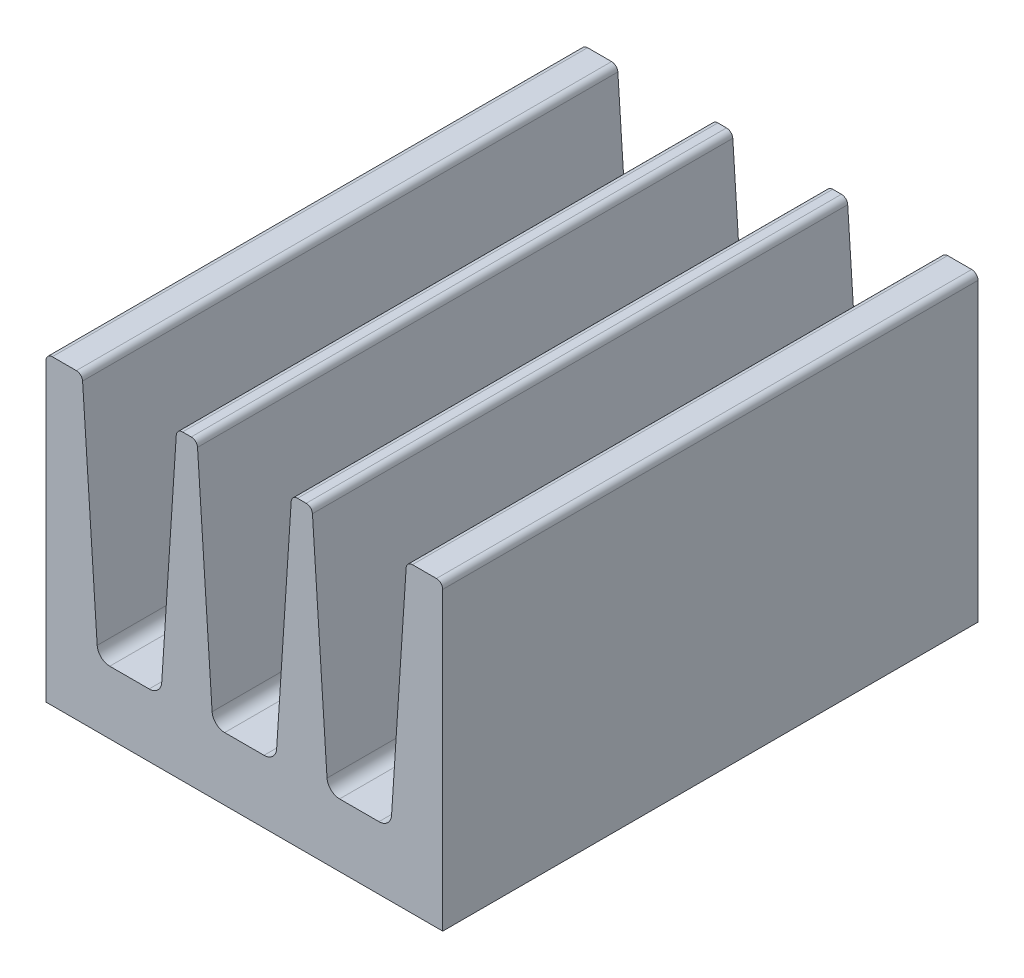
ISO-10303-21;
HEADER;
FILE_DESCRIPTION(('STEP AP214'),'2;1');
FILE_NAME('part.step','',(''),(''),'','','');
FILE_SCHEMA(('AUTOMOTIVE_DESIGN { 1 0 10303 214 1 1 1 1 }'));
ENDSEC;
DATA;
#1=APPLICATION_CONTEXT('core data for automotive mechanical design processes');
#2=APPLICATION_PROTOCOL_DEFINITION('international standard','automotive_design',2000,#1);
#3=PRODUCT_CONTEXT('',#1,'mechanical');
#4=PRODUCT('Part','Part','',(#3));
#5=PRODUCT_RELATED_PRODUCT_CATEGORY('part','',(#4));
#6=PRODUCT_DEFINITION_FORMATION('','',#4);
#7=PRODUCT_DEFINITION_CONTEXT('part definition',#1,'design');
#8=PRODUCT_DEFINITION('design','',#6,#7);
#9=PRODUCT_DEFINITION_SHAPE('','',#8);
#10=(LENGTH_UNIT() NAMED_UNIT(*) SI_UNIT(.MILLI.,.METRE.));
#11=(NAMED_UNIT(*) PLANE_ANGLE_UNIT() SI_UNIT($,.RADIAN.));
#12=(NAMED_UNIT(*) SI_UNIT($,.STERADIAN.) SOLID_ANGLE_UNIT());
#13=UNCERTAINTY_MEASURE_WITH_UNIT(LENGTH_MEASURE(1.E-05),#10,'distance_accuracy_value','');
#14=(GEOMETRIC_REPRESENTATION_CONTEXT(3) GLOBAL_UNCERTAINTY_ASSIGNED_CONTEXT((#13)) GLOBAL_UNIT_ASSIGNED_CONTEXT((#10,
#11,#12)) REPRESENTATION_CONTEXT('',''));
#15=CARTESIAN_POINT('',(0.,0.,0.));
#16=DIRECTION('',(0.,0.,1.));
#17=DIRECTION('',(1.,0.,0.));
#18=AXIS2_PLACEMENT_3D('',#15,#16,#17);
#19=CARTESIAN_POINT('',(0.,4.8,0.));
#20=DIRECTION('',(0.,-1.,0.));
#21=DIRECTION('',(0.,0.,-1.));
#22=AXIS2_PLACEMENT_3D('',#19,#20,#21);
#23=PLANE('',#22);
#24=DIRECTION('',(-1.,0.,0.));
#25=VECTOR('',#24,1.);
#26=CARTESIAN_POINT('',(0.,4.8,-8.5));
#27=LINE('',#26,#25);
#28=CARTESIAN_POINT('',(4.131362768293,4.8,-8.5));
#29=VERTEX_POINT('',#28);
#30=CARTESIAN_POINT('',(3.993637231707,4.8,-8.5));
#31=VERTEX_POINT('',#30);
#32=EDGE_CURVE('E265',#29,#31,#27,.T.);
#33=ORIENTED_EDGE('',*,*,#32,.T.);
#34=DIRECTION('',(0.,0.,-1.));
#35=VECTOR('',#34,1.);
#36=CARTESIAN_POINT('',(3.993637231707,4.8,0.));
#37=LINE('',#36,#35);
#38=CARTESIAN_POINT('',(3.993637231707,4.8,0.));
#39=VERTEX_POINT('',#38);
#40=EDGE_CURVE('E417',#31,#39,#37,.F.);
#41=ORIENTED_EDGE('',*,*,#40,.T.);
#42=DIRECTION('',(1.,0.,0.));
#43=VECTOR('',#42,1.);
#44=CARTESIAN_POINT('',(0.,4.8,0.));
#45=LINE('',#44,#43);
#46=CARTESIAN_POINT('',(4.131362768293,4.8,0.));
#47=VERTEX_POINT('',#46);
#48=EDGE_CURVE('E449',#39,#47,#45,.T.);
#49=ORIENTED_EDGE('',*,*,#48,.T.);
#50=DIRECTION('',(0.,0.,1.));
#51=VECTOR('',#50,1.);
#52=CARTESIAN_POINT('',(4.131362768293,4.8,-8.5));
#53=LINE('',#52,#51);
#54=EDGE_CURVE('E414',#47,#29,#53,.F.);
#55=ORIENTED_EDGE('',*,*,#54,.T.);
#56=EDGE_LOOP('',(#33,#41,#49,#55));
#57=FACE_BOUND('',#56,.T.);
#58=ADVANCED_FACE('F37',(#57),#23,.F.);
#59=CARTESIAN_POINT('',(2.306362768293,4.8,-8.5));
#60=VERTEX_POINT('',#59);
#61=CARTESIAN_POINT('',(2.168637231707,4.8,-8.5));
#62=VERTEX_POINT('',#61);
#63=EDGE_CURVE('E458',#60,#62,#27,.T.);
#64=ORIENTED_EDGE('',*,*,#63,.T.);
#65=DIRECTION('',(0.,0.,-1.));
#66=VECTOR('',#65,1.);
#67=CARTESIAN_POINT('',(2.168637231707,4.8,0.));
#68=LINE('',#67,#66);
#69=CARTESIAN_POINT('',(2.168637231707,4.8,0.));
#70=VERTEX_POINT('',#69);
#71=EDGE_CURVE('E407',#62,#70,#68,.F.);
#72=ORIENTED_EDGE('',*,*,#71,.T.);
#73=CARTESIAN_POINT('',(2.306362768293,4.8,0.));
#74=VERTEX_POINT('',#73);
#75=EDGE_CURVE('E452',#70,#74,#45,.T.);
#76=ORIENTED_EDGE('',*,*,#75,.T.);
#77=DIRECTION('',(0.,0.,1.));
#78=VECTOR('',#77,1.);
#79=CARTESIAN_POINT('',(2.306362768293,4.8,-8.5));
#80=LINE('',#79,#78);
#81=EDGE_CURVE('E404',#74,#60,#80,.F.);
#82=ORIENTED_EDGE('',*,*,#81,.T.);
#83=EDGE_LOOP('',(#64,#72,#76,#82));
#84=FACE_BOUND('',#83,.T.);
#85=ADVANCED_FACE('F464',(#84),#23,.F.);
#86=CARTESIAN_POINT('',(0.481362768293002,4.8,-8.5));
#87=VERTEX_POINT('',#86);
#88=CARTESIAN_POINT('',(0.1,4.8,-8.5));
#89=VERTEX_POINT('',#88);
#90=EDGE_CURVE('E454',#87,#89,#27,.T.);
#91=ORIENTED_EDGE('',*,*,#90,.T.);
#92=DIRECTION('',(0.,0.,1.));
#93=VECTOR('',#92,1.);
#94=CARTESIAN_POINT('',(0.1,4.8,0.));
#95=LINE('',#94,#93);
#96=CARTESIAN_POINT('',(0.1,4.8,0.));
#97=VERTEX_POINT('',#96);
#98=EDGE_CURVE('E368',#89,#97,#95,.T.);
#99=ORIENTED_EDGE('',*,*,#98,.T.);
#100=CARTESIAN_POINT('',(0.481362768293003,4.8,0.));
#101=VERTEX_POINT('',#100);
#102=EDGE_CURVE('E450',#97,#101,#45,.T.);
#103=ORIENTED_EDGE('',*,*,#102,.T.);
#104=DIRECTION('',(0.,0.,1.));
#105=VECTOR('',#104,1.);
#106=CARTESIAN_POINT('',(0.481362768293002,4.8,-8.5));
#107=LINE('',#106,#105);
#108=EDGE_CURVE('E365',#101,#87,#107,.F.);
#109=ORIENTED_EDGE('',*,*,#108,.T.);
#110=EDGE_LOOP('',(#91,#99,#103,#109));
#111=FACE_BOUND('',#110,.T.);
#112=ADVANCED_FACE('F526',(#111),#23,.F.);
#113=CARTESIAN_POINT('',(0.,4.8,0.));
#114=DIRECTION('',(1.,0.,0.));
#115=DIRECTION('',(0.,0.,-1.));
#116=AXIS2_PLACEMENT_3D('',#113,#114,#115);
#117=PLANE('',#116);
#118=DIRECTION('',(0.,-1.,0.));
#119=VECTOR('',#118,1.);
#120=CARTESIAN_POINT('',(0.,4.8,0.));
#121=LINE('',#120,#119);
#122=CARTESIAN_POINT('',(0.,4.7,0.));
#123=VERTEX_POINT('',#122);
#124=CARTESIAN_POINT('',(0.,0.,0.));
#125=VERTEX_POINT('',#124);
#126=EDGE_CURVE('E233',#123,#125,#121,.T.);
#127=ORIENTED_EDGE('',*,*,#126,.F.);
#128=DIRECTION('',(0.,0.,1.));
#129=VECTOR('',#128,1.);
#130=CARTESIAN_POINT('',(0.,4.7,0.));
#131=LINE('',#130,#129);
#132=CARTESIAN_POINT('',(0.,4.7,-8.5));
#133=VERTEX_POINT('',#132);
#134=EDGE_CURVE('E386',#123,#133,#131,.F.);
#135=ORIENTED_EDGE('',*,*,#134,.T.);
#136=DIRECTION('',(0.,-1.,0.));
#137=VECTOR('',#136,1.);
#138=CARTESIAN_POINT('',(0.,4.8,-8.5));
#139=LINE('',#138,#137);
#140=CARTESIAN_POINT('',(0.,0.,-8.5));
#141=VERTEX_POINT('',#140);
#142=EDGE_CURVE('E257',#133,#141,#139,.T.);
#143=ORIENTED_EDGE('',*,*,#142,.T.);
#144=DIRECTION('',(0.,0.,1.));
#145=VECTOR('',#144,1.);
#146=CARTESIAN_POINT('',(0.,0.,0.));
#147=LINE('',#146,#145);
#148=EDGE_CURVE('E251',#141,#125,#147,.T.);
#149=ORIENTED_EDGE('',*,*,#148,.T.);
#150=EDGE_LOOP('',(#127,#135,#143,#149));
#151=FACE_BOUND('',#150,.T.);
#152=ADVANCED_FACE('F255',(#151),#117,.F.);
#153=CARTESIAN_POINT('',(0.,4.8,0.));
#154=DIRECTION('',(0.,0.,-1.));
#155=DIRECTION('',(-1.,0.,0.));
#156=AXIS2_PLACEMENT_3D('',#153,#154,#155);
#157=PLANE('',#156);
#158=ORIENTED_EDGE('',*,*,#102,.F.);
#159=CARTESIAN_POINT('',(0.1,4.7,0.));
#160=DIRECTION('',(0.,0.,-1.));
#161=DIRECTION('',(-1.,0.,0.));
#162=AXIS2_PLACEMENT_3D('',#159,#160,#161);
#163=CIRCLE('',#162,0.1);
#164=EDGE_CURVE('E240',#97,#123,#163,.F.);
#165=ORIENTED_EDGE('',*,*,#164,.T.);
#166=ORIENTED_EDGE('',*,*,#126,.T.);
#167=DIRECTION('',(1.,0.,0.));
#168=VECTOR('',#167,1.);
#169=CARTESIAN_POINT('',(0.,0.,0.));
#170=LINE('',#169,#168);
#171=CARTESIAN_POINT('',(6.3,0.,0.));
#172=VERTEX_POINT('',#171);
#173=EDGE_CURVE('E238',#125,#172,#170,.T.);
#174=ORIENTED_EDGE('',*,*,#173,.T.);
#175=DIRECTION('',(0.,-1.,0.));
#176=VECTOR('',#175,1.);
#177=CARTESIAN_POINT('',(6.3,4.8,0.));
#178=LINE('',#177,#176);
#179=CARTESIAN_POINT('',(6.3,4.7,0.));
#180=VERTEX_POINT('',#179);
#181=EDGE_CURVE('E245',#180,#172,#178,.T.);
#182=ORIENTED_EDGE('',*,*,#181,.F.);
#183=CARTESIAN_POINT('',(6.2,4.7,0.));
#184=DIRECTION('',(0.,0.,-1.));
#185=DIRECTION('',(-1.,0.,0.));
#186=AXIS2_PLACEMENT_3D('',#183,#184,#185);
#187=CIRCLE('',#186,0.1);
#188=CARTESIAN_POINT('',(6.2,4.8,0.));
#189=VERTEX_POINT('',#188);
#190=EDGE_CURVE('E371',#180,#189,#187,.F.);
#191=ORIENTED_EDGE('',*,*,#190,.T.);
#192=CARTESIAN_POINT('',(5.818637231707,4.8,0.));
#193=VERTEX_POINT('',#192);
#194=EDGE_CURVE('E271',#193,#189,#45,.T.);
#195=ORIENTED_EDGE('',*,*,#194,.F.);
#196=CARTESIAN_POINT('',(5.818637231707,4.7,0.));
#197=DIRECTION('',(0.,0.,-1.));
#198=DIRECTION('',(-1.,0.,0.));
#199=AXIS2_PLACEMENT_3D('',#196,#197,#198);
#200=CIRCLE('',#199,0.1);
#201=CARTESIAN_POINT('',(5.71885294445659,4.70656475574016,0.));
#202=VERTEX_POINT('',#201);
#203=EDGE_CURVE('E373',#193,#202,#200,.F.);
#204=ORIENTED_EDGE('',*,*,#203,.T.);
#205=DIRECTION('',(0.0656475574015812,0.997842872504086,0.));
#206=VECTOR('',#205,1.);
#207=CARTESIAN_POINT('',(5.475,0.999999999999813,0.));
#208=LINE('',#207,#206);
#209=CARTESIAN_POINT('',(5.48729411108683,1.18687048851968,0.));
#210=VERTEX_POINT('',#209);
#211=EDGE_CURVE('E303',#202,#210,#208,.F.);
#212=ORIENTED_EDGE('',*,*,#211,.T.);
#213=CARTESIAN_POINT('',(5.28772553658602,1.2,0.));
#214=DIRECTION('',(0.,0.,-1.));
#215=DIRECTION('',(-1.,0.,0.));
#216=AXIS2_PLACEMENT_3D('',#213,#214,#215);
#217=CIRCLE('',#216,0.2);
#218=CARTESIAN_POINT('',(5.28772553658602,1.,0.));
#219=VERTEX_POINT('',#218);
#220=EDGE_CURVE('E359',#210,#219,#217,.T.);
#221=ORIENTED_EDGE('',*,*,#220,.T.);
#222=DIRECTION('',(1.,0.,0.));
#223=VECTOR('',#222,1.);
#224=CARTESIAN_POINT('',(4.475,1.,0.));
#225=LINE('',#224,#223);
#226=CARTESIAN_POINT('',(4.66227446341399,1.,0.));
#227=VERTEX_POINT('',#226);
#228=EDGE_CURVE('E497',#227,#219,#225,.T.);
#229=ORIENTED_EDGE('',*,*,#228,.F.);
#230=CARTESIAN_POINT('',(4.66227446341399,1.2,0.));
#231=DIRECTION('',(0.,0.,-1.));
#232=DIRECTION('',(-1.,0.,0.));
#233=AXIS2_PLACEMENT_3D('',#230,#231,#232);
#234=CIRCLE('',#233,0.2);
#235=CARTESIAN_POINT('',(4.46270588891317,1.18687048851968,0.));
#236=VERTEX_POINT('',#235);
#237=EDGE_CURVE('E361',#227,#236,#234,.T.);
#238=ORIENTED_EDGE('',*,*,#237,.T.);
#239=DIRECTION('',(0.0656475574015812,-0.997842872504086,0.));
#240=VECTOR('',#239,1.);
#241=CARTESIAN_POINT('',(4.475,0.999999999999813,0.));
#242=LINE('',#241,#240);
#243=CARTESIAN_POINT('',(4.23114705554341,4.70656475574016,0.));
#244=VERTEX_POINT('',#243);
#245=EDGE_CURVE('E300',#236,#244,#242,.F.);
#246=ORIENTED_EDGE('',*,*,#245,.T.);
#247=CARTESIAN_POINT('',(4.131362768293,4.7,0.));
#248=DIRECTION('',(0.,0.,-1.));
#249=DIRECTION('',(-1.,0.,0.));
#250=AXIS2_PLACEMENT_3D('',#247,#248,#249);
#251=CIRCLE('',#250,0.1);
#252=EDGE_CURVE('E375',#244,#47,#251,.F.);
#253=ORIENTED_EDGE('',*,*,#252,.T.);
#254=ORIENTED_EDGE('',*,*,#48,.F.);
#255=CARTESIAN_POINT('',(3.993637231707,4.7,0.));
#256=DIRECTION('',(0.,0.,-1.));
#257=DIRECTION('',(-1.,0.,0.));
#258=AXIS2_PLACEMENT_3D('',#255,#256,#257);
#259=CIRCLE('',#258,0.1);
#260=CARTESIAN_POINT('',(3.89385294445659,4.70656475574016,0.));
#261=VERTEX_POINT('',#260);
#262=EDGE_CURVE('E377',#39,#261,#259,.F.);
#263=ORIENTED_EDGE('',*,*,#262,.T.);
#264=DIRECTION('',(0.0656475574015811,0.997842872504086,0.));
#265=VECTOR('',#264,1.);
#266=CARTESIAN_POINT('',(3.65,0.999999999999799,0.));
#267=LINE('',#266,#265);
#268=CARTESIAN_POINT('',(3.66229411108684,1.18687048851968,0.));
#269=VERTEX_POINT('',#268);
#270=EDGE_CURVE('E298',#261,#269,#267,.F.);
#271=ORIENTED_EDGE('',*,*,#270,.T.);
#272=CARTESIAN_POINT('',(3.46272553658602,1.2,0.));
#273=DIRECTION('',(0.,0.,-1.));
#274=DIRECTION('',(-1.,0.,0.));
#275=AXIS2_PLACEMENT_3D('',#272,#273,#274);
#276=CIRCLE('',#275,0.2);
#277=CARTESIAN_POINT('',(3.46272553658602,1.,0.));
#278=VERTEX_POINT('',#277);
#279=EDGE_CURVE('E355',#269,#278,#276,.T.);
#280=ORIENTED_EDGE('',*,*,#279,.T.);
#281=DIRECTION('',(1.,0.,0.));
#282=VECTOR('',#281,1.);
#283=CARTESIAN_POINT('',(2.65,1.,0.));
#284=LINE('',#283,#282);
#285=CARTESIAN_POINT('',(2.83727446341398,1.,0.));
#286=VERTEX_POINT('',#285);
#287=EDGE_CURVE('E488',#286,#278,#284,.T.);
#288=ORIENTED_EDGE('',*,*,#287,.F.);
#289=CARTESIAN_POINT('',(2.83727446341398,1.2,0.));
#290=DIRECTION('',(0.,0.,-1.));
#291=DIRECTION('',(-1.,0.,0.));
#292=AXIS2_PLACEMENT_3D('',#289,#290,#291);
#293=CIRCLE('',#292,0.2);
#294=CARTESIAN_POINT('',(2.63770588891317,1.18687048851968,0.));
#295=VERTEX_POINT('',#294);
#296=EDGE_CURVE('E349',#286,#295,#293,.T.);
#297=ORIENTED_EDGE('',*,*,#296,.T.);
#298=DIRECTION('',(0.0656475574015811,-0.997842872504086,0.));
#299=VECTOR('',#298,1.);
#300=CARTESIAN_POINT('',(2.65,0.999999999999799,0.));
#301=LINE('',#300,#299);
#302=CARTESIAN_POINT('',(2.40614705554341,4.70656475574016,0.));
#303=VERTEX_POINT('',#302);
#304=EDGE_CURVE('E295',#295,#303,#301,.F.);
#305=ORIENTED_EDGE('',*,*,#304,.T.);
#306=CARTESIAN_POINT('',(2.306362768293,4.7,0.));
#307=DIRECTION('',(0.,0.,-1.));
#308=DIRECTION('',(-1.,0.,0.));
#309=AXIS2_PLACEMENT_3D('',#306,#307,#308);
#310=CIRCLE('',#309,0.1);
#311=EDGE_CURVE('E379',#303,#74,#310,.F.);
#312=ORIENTED_EDGE('',*,*,#311,.T.);
#313=ORIENTED_EDGE('',*,*,#75,.F.);
#314=CARTESIAN_POINT('',(2.168637231707,4.7,0.));
#315=DIRECTION('',(0.,0.,-1.));
#316=DIRECTION('',(-1.,0.,0.));
#317=AXIS2_PLACEMENT_3D('',#314,#315,#316);
#318=CIRCLE('',#317,0.1);
#319=CARTESIAN_POINT('',(2.06885294445659,4.70656475574016,0.));
#320=VERTEX_POINT('',#319);
#321=EDGE_CURVE('E381',#70,#320,#318,.F.);
#322=ORIENTED_EDGE('',*,*,#321,.T.);
#323=DIRECTION('',(0.0656475574015811,0.997842872504086,0.));
#324=VECTOR('',#323,1.);
#325=CARTESIAN_POINT('',(1.825,0.999999999999802,0.));
#326=LINE('',#325,#324);
#327=CARTESIAN_POINT('',(1.83729411108684,1.18687048851968,0.));
#328=VERTEX_POINT('',#327);
#329=EDGE_CURVE('E293',#320,#328,#326,.F.);
#330=ORIENTED_EDGE('',*,*,#329,.T.);
#331=CARTESIAN_POINT('',(1.63772553658602,1.2,0.));
#332=DIRECTION('',(0.,0.,-1.));
#333=DIRECTION('',(-1.,0.,0.));
#334=AXIS2_PLACEMENT_3D('',#331,#332,#333);
#335=CIRCLE('',#334,0.2);
#336=CARTESIAN_POINT('',(1.63772553658602,1.,0.));
#337=VERTEX_POINT('',#336);
#338=EDGE_CURVE('E347',#328,#337,#335,.T.);
#339=ORIENTED_EDGE('',*,*,#338,.T.);
#340=DIRECTION('',(1.,0.,0.));
#341=VECTOR('',#340,1.);
#342=CARTESIAN_POINT('',(0.825000000000001,1.,0.));
#343=LINE('',#342,#341);
#344=CARTESIAN_POINT('',(1.01227446341398,1.,0.));
#345=VERTEX_POINT('',#344);
#346=EDGE_CURVE('E262',#345,#337,#343,.T.);
#347=ORIENTED_EDGE('',*,*,#346,.F.);
#348=CARTESIAN_POINT('',(1.01227446341398,1.2,0.));
#349=DIRECTION('',(0.,0.,-1.));
#350=DIRECTION('',(-1.,0.,0.));
#351=AXIS2_PLACEMENT_3D('',#348,#349,#350);
#352=CIRCLE('',#351,0.2);
#353=CARTESIAN_POINT('',(0.812705888913167,1.18687048851968,0.));
#354=VERTEX_POINT('',#353);
#355=EDGE_CURVE('E341',#345,#354,#352,.T.);
#356=ORIENTED_EDGE('',*,*,#355,.T.);
#357=DIRECTION('',(0.0656475574015811,-0.997842872504086,0.));
#358=VECTOR('',#357,1.);
#359=CARTESIAN_POINT('',(0.825000000000001,0.999999999999802,0.));
#360=LINE('',#359,#358);
#361=CARTESIAN_POINT('',(0.581147055543412,4.70656475574016,0.));
#362=VERTEX_POINT('',#361);
#363=EDGE_CURVE('E290',#354,#362,#360,.F.);
#364=ORIENTED_EDGE('',*,*,#363,.T.);
#365=CARTESIAN_POINT('',(0.481362768293003,4.7,0.));
#366=DIRECTION('',(0.,0.,-1.));
#367=DIRECTION('',(-1.,0.,0.));
#368=AXIS2_PLACEMENT_3D('',#365,#366,#367);
#369=CIRCLE('',#368,0.1);
#370=EDGE_CURVE('E383',#362,#101,#369,.F.);
#371=ORIENTED_EDGE('',*,*,#370,.T.);
#372=EDGE_LOOP('',(#158,#165,#166,#174,#182,#191,#195,#204,#212,#221,#229,#238,#246,#253,#254,
#263,#271,#280,#288,#297,#305,#312,#313,#322,#330,#339,#347,#356,#364,#371));
#373=FACE_BOUND('',#372,.T.);
#374=ADVANCED_FACE('F236',(#373),#157,.F.);
#375=CARTESIAN_POINT('',(6.3,4.8,0.));
#376=DIRECTION('',(-1.,0.,0.));
#377=DIRECTION('',(0.,0.,1.));
#378=AXIS2_PLACEMENT_3D('',#375,#376,#377);
#379=PLANE('',#378);
#380=DIRECTION('',(0.,-1.,0.));
#381=VECTOR('',#380,1.);
#382=CARTESIAN_POINT('',(6.3,4.8,-8.5));
#383=LINE('',#382,#381);
#384=CARTESIAN_POINT('',(6.3,4.7,-8.5));
#385=VERTEX_POINT('',#384);
#386=CARTESIAN_POINT('',(6.3,0.,-8.5));
#387=VERTEX_POINT('',#386);
#388=EDGE_CURVE('E273',#385,#387,#383,.T.);
#389=ORIENTED_EDGE('',*,*,#388,.F.);
#390=DIRECTION('',(0.,0.,-1.));
#391=VECTOR('',#390,1.);
#392=CARTESIAN_POINT('',(6.3,4.7,0.));
#393=LINE('',#392,#391);
#394=EDGE_CURVE('E11',#385,#180,#393,.F.);
#395=ORIENTED_EDGE('',*,*,#394,.T.);
#396=ORIENTED_EDGE('',*,*,#181,.T.);
#397=DIRECTION('',(0.,0.,-1.));
#398=VECTOR('',#397,1.);
#399=CARTESIAN_POINT('',(6.3,0.,0.));
#400=LINE('',#399,#398);
#401=EDGE_CURVE('E253',#172,#387,#400,.T.);
#402=ORIENTED_EDGE('',*,*,#401,.T.);
#403=EDGE_LOOP('',(#389,#395,#396,#402));
#404=FACE_BOUND('',#403,.T.);
#405=ADVANCED_FACE('F535',(#404),#379,.F.);
#406=CARTESIAN_POINT('',(0.,4.8,-8.5));
#407=DIRECTION('',(0.,0.,1.));
#408=DIRECTION('',(1.,0.,0.));
#409=AXIS2_PLACEMENT_3D('',#406,#407,#408);
#410=PLANE('',#409);
#411=ORIENTED_EDGE('',*,*,#142,.F.);
#412=CARTESIAN_POINT('',(0.1,4.7,-8.5));
#413=DIRECTION('',(0.,0.,1.));
#414=DIRECTION('',(1.,0.,0.));
#415=AXIS2_PLACEMENT_3D('',#412,#413,#414);
#416=CIRCLE('',#415,0.1);
#417=EDGE_CURVE('E400',#133,#89,#416,.F.);
#418=ORIENTED_EDGE('',*,*,#417,.T.);
#419=ORIENTED_EDGE('',*,*,#90,.F.);
#420=CARTESIAN_POINT('',(0.481362768293002,4.7,-8.5));
#421=DIRECTION('',(0.,0.,1.));
#422=DIRECTION('',(1.,0.,0.));
#423=AXIS2_PLACEMENT_3D('',#420,#421,#422);
#424=CIRCLE('',#423,0.1);
#425=CARTESIAN_POINT('',(0.581147055543411,4.70656475574016,-8.5));
#426=VERTEX_POINT('',#425);
#427=EDGE_CURVE('E398',#87,#426,#424,.F.);
#428=ORIENTED_EDGE('',*,*,#427,.T.);
#429=DIRECTION('',(-0.0656475574015811,0.997842872504086,0.));
#430=VECTOR('',#429,1.);
#431=CARTESIAN_POINT('',(0.825,0.999999999999802,-8.5));
#432=LINE('',#431,#430);
#433=CARTESIAN_POINT('',(0.812705888913167,1.18687048851968,-8.5));
#434=VERTEX_POINT('',#433);
#435=EDGE_CURVE('E244',#426,#434,#432,.F.);
#436=ORIENTED_EDGE('',*,*,#435,.T.);
#437=CARTESIAN_POINT('',(1.01227446341398,1.2,-8.5));
#438=DIRECTION('',(0.,0.,1.));
#439=DIRECTION('',(1.,0.,0.));
#440=AXIS2_PLACEMENT_3D('',#437,#438,#439);
#441=CIRCLE('',#440,0.2);
#442=CARTESIAN_POINT('',(1.01227446341398,1.,-8.5));
#443=VERTEX_POINT('',#442);
#444=EDGE_CURVE('E343',#434,#443,#441,.T.);
#445=ORIENTED_EDGE('',*,*,#444,.T.);
#446=DIRECTION('',(-1.,0.,0.));
#447=VECTOR('',#446,1.);
#448=CARTESIAN_POINT('',(0.825,1.,-8.5));
#449=LINE('',#448,#447);
#450=CARTESIAN_POINT('',(1.63772553658602,1.,-8.5));
#451=VERTEX_POINT('',#450);
#452=EDGE_CURVE('E259',#451,#443,#449,.T.);
#453=ORIENTED_EDGE('',*,*,#452,.F.);
#454=CARTESIAN_POINT('',(1.63772553658602,1.2,-8.5));
#455=DIRECTION('',(0.,0.,1.));
#456=DIRECTION('',(1.,0.,0.));
#457=AXIS2_PLACEMENT_3D('',#454,#455,#456);
#458=CIRCLE('',#457,0.2);
#459=CARTESIAN_POINT('',(1.83729411108683,1.18687048851968,-8.5));
#460=VERTEX_POINT('',#459);
#461=EDGE_CURVE('E345',#451,#460,#458,.T.);
#462=ORIENTED_EDGE('',*,*,#461,.T.);
#463=DIRECTION('',(-0.0656475574015811,-0.997842872504086,0.));
#464=VECTOR('',#463,1.);
#465=CARTESIAN_POINT('',(1.825,0.999999999999802,-8.5));
#466=LINE('',#465,#464);
#467=CARTESIAN_POINT('',(2.06885294445659,4.70656475574016,-8.5));
#468=VERTEX_POINT('',#467);
#469=EDGE_CURVE('E278',#460,#468,#466,.F.);
#470=ORIENTED_EDGE('',*,*,#469,.T.);
#471=CARTESIAN_POINT('',(2.168637231707,4.7,-8.5));
#472=DIRECTION('',(0.,0.,1.));
#473=DIRECTION('',(1.,0.,0.));
#474=AXIS2_PLACEMENT_3D('',#471,#472,#473);
#475=CIRCLE('',#474,0.1);
#476=EDGE_CURVE('E396',#468,#62,#475,.F.);
#477=ORIENTED_EDGE('',*,*,#476,.T.);
#478=ORIENTED_EDGE('',*,*,#63,.F.);
#479=CARTESIAN_POINT('',(2.306362768293,4.7,-8.5));
#480=DIRECTION('',(0.,0.,1.));
#481=DIRECTION('',(1.,0.,0.));
#482=AXIS2_PLACEMENT_3D('',#479,#480,#481);
#483=CIRCLE('',#482,0.1);
#484=CARTESIAN_POINT('',(2.40614705554341,4.70656475574016,-8.5));
#485=VERTEX_POINT('',#484);
#486=EDGE_CURVE('E394',#60,#485,#483,.F.);
#487=ORIENTED_EDGE('',*,*,#486,.T.);
#488=DIRECTION('',(-0.0656475574015811,0.997842872504086,0.));
#489=VECTOR('',#488,1.);
#490=CARTESIAN_POINT('',(2.65,0.999999999999799,-8.5));
#491=LINE('',#490,#489);
#492=CARTESIAN_POINT('',(2.63770588891317,1.18687048851968,-8.5));
#493=VERTEX_POINT('',#492);
#494=EDGE_CURVE('E281',#485,#493,#491,.F.);
#495=ORIENTED_EDGE('',*,*,#494,.T.);
#496=CARTESIAN_POINT('',(2.83727446341398,1.2,-8.5));
#497=DIRECTION('',(0.,0.,1.));
#498=DIRECTION('',(1.,0.,0.));
#499=AXIS2_PLACEMENT_3D('',#496,#497,#498);
#500=CIRCLE('',#499,0.2);
#501=CARTESIAN_POINT('',(2.83727446341398,1.,-8.5));
#502=VERTEX_POINT('',#501);
#503=EDGE_CURVE('E351',#493,#502,#500,.T.);
#504=ORIENTED_EDGE('',*,*,#503,.T.);
#505=DIRECTION('',(-1.,0.,0.));
#506=VECTOR('',#505,1.);
#507=CARTESIAN_POINT('',(2.65,1.,-8.5));
#508=LINE('',#507,#506);
#509=CARTESIAN_POINT('',(3.46272553658602,1.,-8.5));
#510=VERTEX_POINT('',#509);
#511=EDGE_CURVE('E482',#510,#502,#508,.T.);
#512=ORIENTED_EDGE('',*,*,#511,.F.);
#513=CARTESIAN_POINT('',(3.46272553658602,1.2,-8.5));
#514=DIRECTION('',(0.,0.,1.));
#515=DIRECTION('',(1.,0.,0.));
#516=AXIS2_PLACEMENT_3D('',#513,#514,#515);
#517=CIRCLE('',#516,0.2);
#518=CARTESIAN_POINT('',(3.66229411108683,1.18687048851968,-8.5));
#519=VERTEX_POINT('',#518);
#520=EDGE_CURVE('E353',#510,#519,#517,.T.);
#521=ORIENTED_EDGE('',*,*,#520,.T.);
#522=DIRECTION('',(-0.0656475574015811,-0.997842872504086,0.));
#523=VECTOR('',#522,1.);
#524=CARTESIAN_POINT('',(3.65,0.999999999999799,-8.5));
#525=LINE('',#524,#523);
#526=CARTESIAN_POINT('',(3.89385294445659,4.70656475574016,-8.5));
#527=VERTEX_POINT('',#526);
#528=EDGE_CURVE('E283',#519,#527,#525,.F.);
#529=ORIENTED_EDGE('',*,*,#528,.T.);
#530=CARTESIAN_POINT('',(3.993637231707,4.7,-8.5));
#531=DIRECTION('',(0.,0.,1.));
#532=DIRECTION('',(1.,0.,0.));
#533=AXIS2_PLACEMENT_3D('',#530,#531,#532);
#534=CIRCLE('',#533,0.1);
#535=EDGE_CURVE('E58',#527,#31,#534,.F.);
#536=ORIENTED_EDGE('',*,*,#535,.T.);
#537=ORIENTED_EDGE('',*,*,#32,.F.);
#538=CARTESIAN_POINT('',(4.131362768293,4.7,-8.5));
#539=DIRECTION('',(0.,0.,1.));
#540=DIRECTION('',(1.,0.,0.));
#541=AXIS2_PLACEMENT_3D('',#538,#539,#540);
#542=CIRCLE('',#541,0.1);
#543=CARTESIAN_POINT('',(4.23114705554341,4.70656475574016,-8.5));
#544=VERTEX_POINT('',#543);
#545=EDGE_CURVE('E52',#29,#544,#542,.F.);
#546=ORIENTED_EDGE('',*,*,#545,.T.);
#547=DIRECTION('',(-0.0656475574015812,0.997842872504086,0.));
#548=VECTOR('',#547,1.);
#549=CARTESIAN_POINT('',(4.475,0.999999999999813,-8.5));
#550=LINE('',#549,#548);
#551=CARTESIAN_POINT('',(4.46270588891317,1.18687048851968,-8.5));
#552=VERTEX_POINT('',#551);
#553=EDGE_CURVE('E285',#544,#552,#550,.F.);
#554=ORIENTED_EDGE('',*,*,#553,.T.);
#555=CARTESIAN_POINT('',(4.66227446341399,1.2,-8.5));
#556=DIRECTION('',(0.,0.,1.));
#557=DIRECTION('',(1.,0.,0.));
#558=AXIS2_PLACEMENT_3D('',#555,#556,#557);
#559=CIRCLE('',#558,0.2);
#560=CARTESIAN_POINT('',(4.66227446341399,1.,-8.5));
#561=VERTEX_POINT('',#560);
#562=EDGE_CURVE('E363',#552,#561,#559,.T.);
#563=ORIENTED_EDGE('',*,*,#562,.T.);
#564=DIRECTION('',(-1.,0.,0.));
#565=VECTOR('',#564,1.);
#566=CARTESIAN_POINT('',(4.475,1.,-8.5));
#567=LINE('',#566,#565);
#568=CARTESIAN_POINT('',(5.28772553658602,1.,-8.5));
#569=VERTEX_POINT('',#568);
#570=EDGE_CURVE('E492',#569,#561,#567,.T.);
#571=ORIENTED_EDGE('',*,*,#570,.F.);
#572=CARTESIAN_POINT('',(5.28772553658602,1.2,-8.5));
#573=DIRECTION('',(0.,0.,1.));
#574=DIRECTION('',(1.,0.,0.));
#575=AXIS2_PLACEMENT_3D('',#572,#573,#574);
#576=CIRCLE('',#575,0.2);
#577=CARTESIAN_POINT('',(5.48729411108683,1.18687048851968,-8.5));
#578=VERTEX_POINT('',#577);
#579=EDGE_CURVE('E357',#569,#578,#576,.T.);
#580=ORIENTED_EDGE('',*,*,#579,.T.);
#581=DIRECTION('',(-0.0656475574015812,-0.997842872504086,0.));
#582=VECTOR('',#581,1.);
#583=CARTESIAN_POINT('',(5.475,0.999999999999813,-8.5));
#584=LINE('',#583,#582);
#585=CARTESIAN_POINT('',(5.71885294445659,4.70656475574016,-8.5));
#586=VERTEX_POINT('',#585);
#587=EDGE_CURVE('E287',#578,#586,#584,.F.);
#588=ORIENTED_EDGE('',*,*,#587,.T.);
#589=CARTESIAN_POINT('',(5.818637231707,4.7,-8.5));
#590=DIRECTION('',(0.,0.,1.));
#591=DIRECTION('',(1.,0.,0.));
#592=AXIS2_PLACEMENT_3D('',#589,#590,#591);
#593=CIRCLE('',#592,0.1);
#594=CARTESIAN_POINT('',(5.818637231707,4.8,-8.5));
#595=VERTEX_POINT('',#594);
#596=EDGE_CURVE('E390',#586,#595,#593,.F.);
#597=ORIENTED_EDGE('',*,*,#596,.T.);
#598=CARTESIAN_POINT('',(6.2,4.8,-8.5));
#599=VERTEX_POINT('',#598);
#600=EDGE_CURVE('E274',#599,#595,#27,.T.);
#601=ORIENTED_EDGE('',*,*,#600,.F.);
#602=CARTESIAN_POINT('',(6.2,4.7,-8.5));
#603=DIRECTION('',(0.,0.,1.));
#604=DIRECTION('',(1.,0.,0.));
#605=AXIS2_PLACEMENT_3D('',#602,#603,#604);
#606=CIRCLE('',#605,0.1);
#607=EDGE_CURVE('E388',#599,#385,#606,.F.);
#608=ORIENTED_EDGE('',*,*,#607,.T.);
#609=ORIENTED_EDGE('',*,*,#388,.T.);
#610=DIRECTION('',(-1.,0.,0.));
#611=VECTOR('',#610,1.);
#612=CARTESIAN_POINT('',(0.,0.,-8.5));
#613=LINE('',#612,#611);
#614=EDGE_CURVE('E269',#387,#141,#613,.T.);
#615=ORIENTED_EDGE('',*,*,#614,.T.);
#616=EDGE_LOOP('',(#411,#418,#419,#428,#436,#445,#453,#462,#470,#477,#478,#487,#495,#504,#512,
#521,#529,#536,#537,#546,#554,#563,#571,#580,#588,#597,#601,#608,#609,#615));
#617=FACE_BOUND('',#616,.T.);
#618=ADVANCED_FACE('F437',(#617),#410,.F.);
#619=ORIENTED_EDGE('',*,*,#600,.T.);
#620=DIRECTION('',(0.,0.,-1.));
#621=VECTOR('',#620,1.);
#622=CARTESIAN_POINT('',(5.818637231707,4.8,0.));
#623=LINE('',#622,#621);
#624=EDGE_CURVE('E427',#595,#193,#623,.F.);
#625=ORIENTED_EDGE('',*,*,#624,.T.);
#626=ORIENTED_EDGE('',*,*,#194,.T.);
#627=DIRECTION('',(0.,0.,-1.));
#628=VECTOR('',#627,1.);
#629=CARTESIAN_POINT('',(6.2,4.8,0.));
#630=LINE('',#629,#628);
#631=EDGE_CURVE('E424',#189,#599,#630,.T.);
#632=ORIENTED_EDGE('',*,*,#631,.T.);
#633=EDGE_LOOP('',(#619,#625,#626,#632));
#634=FACE_BOUND('',#633,.T.);
#635=ADVANCED_FACE('F446',(#634),#23,.F.);
#636=CARTESIAN_POINT('',(0.,0.,0.));
#637=DIRECTION('',(0.,-1.,0.));
#638=DIRECTION('',(0.,0.,-1.));
#639=AXIS2_PLACEMENT_3D('',#636,#637,#638);
#640=PLANE('',#639);
#641=ORIENTED_EDGE('',*,*,#148,.F.);
#642=ORIENTED_EDGE('',*,*,#614,.F.);
#643=ORIENTED_EDGE('',*,*,#401,.F.);
#644=ORIENTED_EDGE('',*,*,#173,.F.);
#645=EDGE_LOOP('',(#641,#642,#643,#644));
#646=FACE_BOUND('',#645,.T.);
#647=ADVANCED_FACE('F249',(#646),#640,.T.);
#648=CARTESIAN_POINT('',(0.,1.,0.));
#649=DIRECTION('',(0.,1.,0.));
#650=DIRECTION('',(0.,0.,1.));
#651=AXIS2_PLACEMENT_3D('',#648,#649,#650);
#652=PLANE('',#651);
#653=ORIENTED_EDGE('',*,*,#452,.T.);
#654=DIRECTION('',(0.,0.,-1.));
#655=VECTOR('',#654,1.);
#656=CARTESIAN_POINT('',(1.01227446341398,1.,0.));
#657=LINE('',#656,#655);
#658=EDGE_CURVE('E308',#443,#345,#657,.F.);
#659=ORIENTED_EDGE('',*,*,#658,.T.);
#660=ORIENTED_EDGE('',*,*,#346,.T.);
#661=DIRECTION('',(0.,0.,1.));
#662=VECTOR('',#661,1.);
#663=CARTESIAN_POINT('',(1.63772553658602,1.,-8.5));
#664=LINE('',#663,#662);
#665=EDGE_CURVE('E305',#337,#451,#664,.F.);
#666=ORIENTED_EDGE('',*,*,#665,.T.);
#667=EDGE_LOOP('',(#653,#659,#660,#666));
#668=FACE_BOUND('',#667,.T.);
#669=ADVANCED_FACE('F534',(#668),#652,.T.);
#670=CARTESIAN_POINT('',(0.,1.,0.));
#671=DIRECTION('',(0.,1.,0.));
#672=DIRECTION('',(0.,0.,1.));
#673=AXIS2_PLACEMENT_3D('',#670,#671,#672);
#674=PLANE('',#673);
#675=ORIENTED_EDGE('',*,*,#511,.T.);
#676=DIRECTION('',(0.,0.,-1.));
#677=VECTOR('',#676,1.);
#678=CARTESIAN_POINT('',(2.83727446341398,1.,0.));
#679=LINE('',#678,#677);
#680=EDGE_CURVE('E320',#502,#286,#679,.F.);
#681=ORIENTED_EDGE('',*,*,#680,.T.);
#682=ORIENTED_EDGE('',*,*,#287,.T.);
#683=DIRECTION('',(0.,0.,1.));
#684=VECTOR('',#683,1.);
#685=CARTESIAN_POINT('',(3.46272553658602,1.,-8.49999999999999));
#686=LINE('',#685,#684);
#687=EDGE_CURVE('E317',#278,#510,#686,.F.);
#688=ORIENTED_EDGE('',*,*,#687,.T.);
#689=EDGE_LOOP('',(#675,#681,#682,#688));
#690=FACE_BOUND('',#689,.T.);
#691=ADVANCED_FACE('F484',(#690),#674,.T.);
#692=CARTESIAN_POINT('',(0.,1.,0.));
#693=DIRECTION('',(0.,1.,0.));
#694=DIRECTION('',(0.,0.,1.));
#695=AXIS2_PLACEMENT_3D('',#692,#693,#694);
#696=PLANE('',#695);
#697=ORIENTED_EDGE('',*,*,#228,.T.);
#698=DIRECTION('',(0.,0.,1.));
#699=VECTOR('',#698,1.);
#700=CARTESIAN_POINT('',(5.28772553658602,1.,-8.5));
#701=LINE('',#700,#699);
#702=EDGE_CURVE('E332',#219,#569,#701,.F.);
#703=ORIENTED_EDGE('',*,*,#702,.T.);
#704=ORIENTED_EDGE('',*,*,#570,.T.);
#705=DIRECTION('',(0.,0.,-1.));
#706=VECTOR('',#705,1.);
#707=CARTESIAN_POINT('',(4.66227446341399,1.,0.));
#708=LINE('',#707,#706);
#709=EDGE_CURVE('E329',#561,#227,#708,.F.);
#710=ORIENTED_EDGE('',*,*,#709,.T.);
#711=EDGE_LOOP('',(#697,#703,#704,#710));
#712=FACE_BOUND('',#711,.T.);
#713=ADVANCED_FACE('F502',(#712),#696,.T.);
#714=CARTESIAN_POINT('',(5.475,0.999999999999813,-8.5));
#715=DIRECTION('',(0.997842872504086,-0.0656475574015812,0.));
#716=DIRECTION('',(0.,0.,-1.));
#717=AXIS2_PLACEMENT_3D('',#714,#715,#716);
#718=PLANE('',#717);
#719=ORIENTED_EDGE('',*,*,#211,.F.);
#720=DIRECTION('',(0.,0.,1.));
#721=VECTOR('',#720,1.);
#722=CARTESIAN_POINT('',(5.71885294445659,4.70656475574016,-8.5));
#723=LINE('',#722,#721);
#724=EDGE_CURVE('E45',#202,#586,#723,.F.);
#725=ORIENTED_EDGE('',*,*,#724,.T.);
#726=ORIENTED_EDGE('',*,*,#587,.F.);
#727=DIRECTION('',(0.,0.,-1.));
#728=VECTOR('',#727,1.);
#729=CARTESIAN_POINT('',(5.48729411108683,1.18687048851968,0.));
#730=LINE('',#729,#728);
#731=EDGE_CURVE('E335',#578,#210,#730,.F.);
#732=ORIENTED_EDGE('',*,*,#731,.T.);
#733=EDGE_LOOP('',(#719,#725,#726,#732));
#734=FACE_BOUND('',#733,.T.);
#735=ADVANCED_FACE('F433',(#734),#718,.F.);
#736=CARTESIAN_POINT('',(4.475,0.999999999999813,-8.5));
#737=DIRECTION('',(-0.997842872504086,-0.0656475574015812,0.));
#738=DIRECTION('',(0.,0.,1.));
#739=AXIS2_PLACEMENT_3D('',#736,#737,#738);
#740=PLANE('',#739);
#741=ORIENTED_EDGE('',*,*,#553,.F.);
#742=DIRECTION('',(0.,0.,-1.));
#743=VECTOR('',#742,1.);
#744=CARTESIAN_POINT('',(4.23114705554341,4.70656475574016,0.));
#745=LINE('',#744,#743);
#746=EDGE_CURVE('E422',#544,#244,#745,.F.);
#747=ORIENTED_EDGE('',*,*,#746,.T.);
#748=ORIENTED_EDGE('',*,*,#245,.F.);
#749=DIRECTION('',(0.,0.,1.));
#750=VECTOR('',#749,1.);
#751=CARTESIAN_POINT('',(4.46270588891317,1.18687048851968,-8.5));
#752=LINE('',#751,#750);
#753=EDGE_CURVE('E338',#236,#552,#752,.F.);
#754=ORIENTED_EDGE('',*,*,#753,.T.);
#755=EDGE_LOOP('',(#741,#747,#748,#754));
#756=FACE_BOUND('',#755,.T.);
#757=ADVANCED_FACE('F678',(#756),#740,.F.);
#758=CARTESIAN_POINT('',(3.65,0.999999999999799,-8.5));
#759=DIRECTION('',(0.997842872504086,-0.0656475574015811,0.));
#760=DIRECTION('',(0.,0.,-1.));
#761=AXIS2_PLACEMENT_3D('',#758,#759,#760);
#762=PLANE('',#761);
#763=ORIENTED_EDGE('',*,*,#270,.F.);
#764=DIRECTION('',(0.,0.,1.));
#765=VECTOR('',#764,1.);
#766=CARTESIAN_POINT('',(3.89385294445659,4.70656475574016,-8.5));
#767=LINE('',#766,#765);
#768=EDGE_CURVE('E420',#261,#527,#767,.F.);
#769=ORIENTED_EDGE('',*,*,#768,.T.);
#770=ORIENTED_EDGE('',*,*,#528,.F.);
#771=DIRECTION('',(0.,0.,-1.));
#772=VECTOR('',#771,1.);
#773=CARTESIAN_POINT('',(3.66229411108684,1.18687048851968,0.));
#774=LINE('',#773,#772);
#775=EDGE_CURVE('E326',#519,#269,#774,.F.);
#776=ORIENTED_EDGE('',*,*,#775,.T.);
#777=EDGE_LOOP('',(#763,#769,#770,#776));
#778=FACE_BOUND('',#777,.T.);
#779=ADVANCED_FACE('F669',(#778),#762,.F.);
#780=CARTESIAN_POINT('',(2.65,0.999999999999799,-8.5));
#781=DIRECTION('',(-0.997842872504086,-0.0656475574015811,0.));
#782=DIRECTION('',(0.,0.,1.));
#783=AXIS2_PLACEMENT_3D('',#780,#781,#782);
#784=PLANE('',#783);
#785=ORIENTED_EDGE('',*,*,#494,.F.);
#786=DIRECTION('',(0.,0.,-1.));
#787=VECTOR('',#786,1.);
#788=CARTESIAN_POINT('',(2.40614705554341,4.70656475574016,0.));
#789=LINE('',#788,#787);
#790=EDGE_CURVE('E412',#485,#303,#789,.F.);
#791=ORIENTED_EDGE('',*,*,#790,.T.);
#792=ORIENTED_EDGE('',*,*,#304,.F.);
#793=DIRECTION('',(0.,0.,1.));
#794=VECTOR('',#793,1.);
#795=CARTESIAN_POINT('',(2.63770588891317,1.18687048851968,-8.5));
#796=LINE('',#795,#794);
#797=EDGE_CURVE('E323',#295,#493,#796,.F.);
#798=ORIENTED_EDGE('',*,*,#797,.T.);
#799=EDGE_LOOP('',(#785,#791,#792,#798));
#800=FACE_BOUND('',#799,.T.);
#801=ADVANCED_FACE('F473',(#800),#784,.F.);
#802=CARTESIAN_POINT('',(1.825,0.999999999999802,-8.5));
#803=DIRECTION('',(0.997842872504086,-0.065647557401581,0.));
#804=DIRECTION('',(0.,0.,-1.));
#805=AXIS2_PLACEMENT_3D('',#802,#803,#804);
#806=PLANE('',#805);
#807=ORIENTED_EDGE('',*,*,#329,.F.);
#808=DIRECTION('',(0.,0.,1.));
#809=VECTOR('',#808,1.);
#810=CARTESIAN_POINT('',(2.06885294445659,4.70656475574016,-8.5));
#811=LINE('',#810,#809);
#812=EDGE_CURVE('E410',#320,#468,#811,.F.);
#813=ORIENTED_EDGE('',*,*,#812,.T.);
#814=ORIENTED_EDGE('',*,*,#469,.F.);
#815=DIRECTION('',(0.,0.,-1.));
#816=VECTOR('',#815,1.);
#817=CARTESIAN_POINT('',(1.83729411108684,1.18687048851968,0.));
#818=LINE('',#817,#816);
#819=EDGE_CURVE('E314',#460,#328,#818,.F.);
#820=ORIENTED_EDGE('',*,*,#819,.T.);
#821=EDGE_LOOP('',(#807,#813,#814,#820));
#822=FACE_BOUND('',#821,.T.);
#823=ADVANCED_FACE('F556',(#822),#806,.F.);
#824=CARTESIAN_POINT('',(0.825,0.999999999999802,-8.5));
#825=DIRECTION('',(-0.997842872504086,-0.0656475574015811,0.));
#826=DIRECTION('',(0.,0.,1.));
#827=AXIS2_PLACEMENT_3D('',#824,#825,#826);
#828=PLANE('',#827);
#829=ORIENTED_EDGE('',*,*,#435,.F.);
#830=DIRECTION('',(0.,0.,-1.));
#831=VECTOR('',#830,1.);
#832=CARTESIAN_POINT('',(0.581147055543412,4.70656475574016,0.));
#833=LINE('',#832,#831);
#834=EDGE_CURVE('E402',#426,#362,#833,.F.);
#835=ORIENTED_EDGE('',*,*,#834,.T.);
#836=ORIENTED_EDGE('',*,*,#363,.F.);
#837=DIRECTION('',(0.,0.,1.));
#838=VECTOR('',#837,1.);
#839=CARTESIAN_POINT('',(0.812705888913167,1.18687048851968,-8.5));
#840=LINE('',#839,#838);
#841=EDGE_CURVE('E311',#354,#434,#840,.F.);
#842=ORIENTED_EDGE('',*,*,#841,.T.);
#843=EDGE_LOOP('',(#829,#835,#836,#842));
#844=FACE_BOUND('',#843,.T.);
#845=ADVANCED_FACE('F575',(#844),#828,.F.);
#846=CARTESIAN_POINT('',(1.01227446341398,1.2,0.));
#847=DIRECTION('',(0.,0.,1.));
#848=DIRECTION('',(1.,0.,0.));
#849=AXIS2_PLACEMENT_3D('',#846,#847,#848);
#850=CYLINDRICAL_SURFACE('',#849,0.2);
#851=ORIENTED_EDGE('',*,*,#444,.F.);
#852=ORIENTED_EDGE('',*,*,#841,.F.);
#853=ORIENTED_EDGE('',*,*,#355,.F.);
#854=ORIENTED_EDGE('',*,*,#658,.F.);
#855=EDGE_LOOP('',(#851,#852,#853,#854));
#856=FACE_BOUND('',#855,.T.);
#857=ADVANCED_FACE('F569',(#856),#850,.F.);
#858=CARTESIAN_POINT('',(1.63772553658602,1.2,0.));
#859=DIRECTION('',(0.,0.,-1.));
#860=DIRECTION('',(-1.,0.,0.));
#861=AXIS2_PLACEMENT_3D('',#858,#859,#860);
#862=CYLINDRICAL_SURFACE('',#861,0.2);
#863=ORIENTED_EDGE('',*,*,#338,.F.);
#864=ORIENTED_EDGE('',*,*,#819,.F.);
#865=ORIENTED_EDGE('',*,*,#461,.F.);
#866=ORIENTED_EDGE('',*,*,#665,.F.);
#867=EDGE_LOOP('',(#863,#864,#865,#866));
#868=FACE_BOUND('',#867,.T.);
#869=ADVANCED_FACE('F562',(#868),#862,.F.);
#870=CARTESIAN_POINT('',(2.83727446341398,1.2,0.));
#871=DIRECTION('',(0.,0.,1.));
#872=DIRECTION('',(1.,0.,0.));
#873=AXIS2_PLACEMENT_3D('',#870,#871,#872);
#874=CYLINDRICAL_SURFACE('',#873,0.2);
#875=ORIENTED_EDGE('',*,*,#503,.F.);
#876=ORIENTED_EDGE('',*,*,#797,.F.);
#877=ORIENTED_EDGE('',*,*,#296,.F.);
#878=ORIENTED_EDGE('',*,*,#680,.F.);
#879=EDGE_LOOP('',(#875,#876,#877,#878));
#880=FACE_BOUND('',#879,.T.);
#881=ADVANCED_FACE('F479',(#880),#874,.F.);
#882=CARTESIAN_POINT('',(3.46272553658602,1.2,0.));
#883=DIRECTION('',(0.,0.,-1.));
#884=DIRECTION('',(-1.,0.,0.));
#885=AXIS2_PLACEMENT_3D('',#882,#883,#884);
#886=CYLINDRICAL_SURFACE('',#885,0.2);
#887=ORIENTED_EDGE('',*,*,#279,.F.);
#888=ORIENTED_EDGE('',*,*,#775,.F.);
#889=ORIENTED_EDGE('',*,*,#520,.F.);
#890=ORIENTED_EDGE('',*,*,#687,.F.);
#891=EDGE_LOOP('',(#887,#888,#889,#890));
#892=FACE_BOUND('',#891,.T.);
#893=ADVANCED_FACE('F509',(#892),#886,.F.);
#894=CARTESIAN_POINT('',(5.28772553658602,1.2,0.));
#895=DIRECTION('',(0.,0.,-1.));
#896=DIRECTION('',(-1.,0.,0.));
#897=AXIS2_PLACEMENT_3D('',#894,#895,#896);
#898=CYLINDRICAL_SURFACE('',#897,0.2);
#899=ORIENTED_EDGE('',*,*,#220,.F.);
#900=ORIENTED_EDGE('',*,*,#731,.F.);
#901=ORIENTED_EDGE('',*,*,#579,.F.);
#902=ORIENTED_EDGE('',*,*,#702,.F.);
#903=EDGE_LOOP('',(#899,#900,#901,#902));
#904=FACE_BOUND('',#903,.T.);
#905=ADVANCED_FACE('F506',(#904),#898,.F.);
#906=CARTESIAN_POINT('',(4.66227446341399,1.2,0.));
#907=DIRECTION('',(0.,0.,1.));
#908=DIRECTION('',(1.,0.,0.));
#909=AXIS2_PLACEMENT_3D('',#906,#907,#908);
#910=CYLINDRICAL_SURFACE('',#909,0.2);
#911=ORIENTED_EDGE('',*,*,#562,.F.);
#912=ORIENTED_EDGE('',*,*,#753,.F.);
#913=ORIENTED_EDGE('',*,*,#237,.F.);
#914=ORIENTED_EDGE('',*,*,#709,.F.);
#915=EDGE_LOOP('',(#911,#912,#913,#914));
#916=FACE_BOUND('',#915,.T.);
#917=ADVANCED_FACE('F508',(#916),#910,.F.);
#918=CARTESIAN_POINT('',(0.1,4.7,0.));
#919=DIRECTION('',(0.,0.,1.));
#920=DIRECTION('',(1.,0.,0.));
#921=AXIS2_PLACEMENT_3D('',#918,#919,#920);
#922=CYLINDRICAL_SURFACE('',#921,0.1);
#923=ORIENTED_EDGE('',*,*,#417,.F.);
#924=ORIENTED_EDGE('',*,*,#134,.F.);
#925=ORIENTED_EDGE('',*,*,#164,.F.);
#926=ORIENTED_EDGE('',*,*,#98,.F.);
#927=EDGE_LOOP('',(#923,#924,#925,#926));
#928=FACE_BOUND('',#927,.T.);
#929=ADVANCED_FACE('F515',(#928),#922,.T.);
#930=CARTESIAN_POINT('',(0.481362768293003,4.7,0.));
#931=DIRECTION('',(0.,0.,-1.));
#932=DIRECTION('',(-1.,0.,0.));
#933=AXIS2_PLACEMENT_3D('',#930,#931,#932);
#934=CYLINDRICAL_SURFACE('',#933,0.1);
#935=ORIENTED_EDGE('',*,*,#370,.F.);
#936=ORIENTED_EDGE('',*,*,#834,.F.);
#937=ORIENTED_EDGE('',*,*,#427,.F.);
#938=ORIENTED_EDGE('',*,*,#108,.F.);
#939=EDGE_LOOP('',(#935,#936,#937,#938));
#940=FACE_BOUND('',#939,.T.);
#941=ADVANCED_FACE('F578',(#940),#934,.T.);
#942=CARTESIAN_POINT('',(2.168637231707,4.7,0.));
#943=DIRECTION('',(0.,0.,1.));
#944=DIRECTION('',(1.,0.,0.));
#945=AXIS2_PLACEMENT_3D('',#942,#943,#944);
#946=CYLINDRICAL_SURFACE('',#945,0.1);
#947=ORIENTED_EDGE('',*,*,#476,.F.);
#948=ORIENTED_EDGE('',*,*,#812,.F.);
#949=ORIENTED_EDGE('',*,*,#321,.F.);
#950=ORIENTED_EDGE('',*,*,#71,.F.);
#951=EDGE_LOOP('',(#947,#948,#949,#950));
#952=FACE_BOUND('',#951,.T.);
#953=ADVANCED_FACE('F552',(#952),#946,.T.);
#954=CARTESIAN_POINT('',(2.306362768293,4.7,0.));
#955=DIRECTION('',(0.,0.,-1.));
#956=DIRECTION('',(-1.,0.,0.));
#957=AXIS2_PLACEMENT_3D('',#954,#955,#956);
#958=CYLINDRICAL_SURFACE('',#957,0.1);
#959=ORIENTED_EDGE('',*,*,#311,.F.);
#960=ORIENTED_EDGE('',*,*,#790,.F.);
#961=ORIENTED_EDGE('',*,*,#486,.F.);
#962=ORIENTED_EDGE('',*,*,#81,.F.);
#963=EDGE_LOOP('',(#959,#960,#961,#962));
#964=FACE_BOUND('',#963,.T.);
#965=ADVANCED_FACE('F469',(#964),#958,.T.);
#966=CARTESIAN_POINT('',(3.993637231707,4.7,0.));
#967=DIRECTION('',(0.,0.,1.));
#968=DIRECTION('',(1.,0.,0.));
#969=AXIS2_PLACEMENT_3D('',#966,#967,#968);
#970=CYLINDRICAL_SURFACE('',#969,0.1);
#971=ORIENTED_EDGE('',*,*,#535,.F.);
#972=ORIENTED_EDGE('',*,*,#768,.F.);
#973=ORIENTED_EDGE('',*,*,#262,.F.);
#974=ORIENTED_EDGE('',*,*,#40,.F.);
#975=EDGE_LOOP('',(#971,#972,#973,#974));
#976=FACE_BOUND('',#975,.T.);
#977=ADVANCED_FACE('F590',(#976),#970,.T.);
#978=CARTESIAN_POINT('',(4.131362768293,4.7,0.));
#979=DIRECTION('',(0.,0.,-1.));
#980=DIRECTION('',(-1.,0.,0.));
#981=AXIS2_PLACEMENT_3D('',#978,#979,#980);
#982=CYLINDRICAL_SURFACE('',#981,0.1);
#983=ORIENTED_EDGE('',*,*,#252,.F.);
#984=ORIENTED_EDGE('',*,*,#746,.F.);
#985=ORIENTED_EDGE('',*,*,#545,.F.);
#986=ORIENTED_EDGE('',*,*,#54,.F.);
#987=EDGE_LOOP('',(#983,#984,#985,#986));
#988=FACE_BOUND('',#987,.T.);
#989=ADVANCED_FACE('F593',(#988),#982,.T.);
#990=CARTESIAN_POINT('',(5.818637231707,4.7,0.));
#991=DIRECTION('',(0.,0.,1.));
#992=DIRECTION('',(1.,0.,0.));
#993=AXIS2_PLACEMENT_3D('',#990,#991,#992);
#994=CYLINDRICAL_SURFACE('',#993,0.1);
#995=ORIENTED_EDGE('',*,*,#596,.F.);
#996=ORIENTED_EDGE('',*,*,#724,.F.);
#997=ORIENTED_EDGE('',*,*,#203,.F.);
#998=ORIENTED_EDGE('',*,*,#624,.F.);
#999=EDGE_LOOP('',(#995,#996,#997,#998));
#1000=FACE_BOUND('',#999,.T.);
#1001=ADVANCED_FACE('F442',(#1000),#994,.T.);
#1002=CARTESIAN_POINT('',(6.2,4.7,0.));
#1003=DIRECTION('',(0.,0.,-1.));
#1004=DIRECTION('',(-1.,0.,0.));
#1005=AXIS2_PLACEMENT_3D('',#1002,#1003,#1004);
#1006=CYLINDRICAL_SURFACE('',#1005,0.1);
#1007=ORIENTED_EDGE('',*,*,#190,.F.);
#1008=ORIENTED_EDGE('',*,*,#394,.F.);
#1009=ORIENTED_EDGE('',*,*,#607,.F.);
#1010=ORIENTED_EDGE('',*,*,#631,.F.);
#1011=EDGE_LOOP('',(#1007,#1008,#1009,#1010));
#1012=FACE_BOUND('',#1011,.T.);
#1013=ADVANCED_FACE('F39',(#1012),#1006,.T.);
#1014=CLOSED_SHELL('',(#58,#85,#112,#152,#374,#405,#618,#635,#647,#669,#691,#713,#735,#757,#779,
#801,#823,#845,#857,#869,#881,#893,#905,#917,#929,#941,#953,#965,#977,#989,#1001,#1013));
#1015=MANIFOLD_SOLID_BREP('B2',#1014);
#1016=ADVANCED_BREP_SHAPE_REPRESENTATION('',(#18,#1015),#14);
#1017=SHAPE_DEFINITION_REPRESENTATION(#9,#1016);
ENDSEC;
END-ISO-10303-21;
